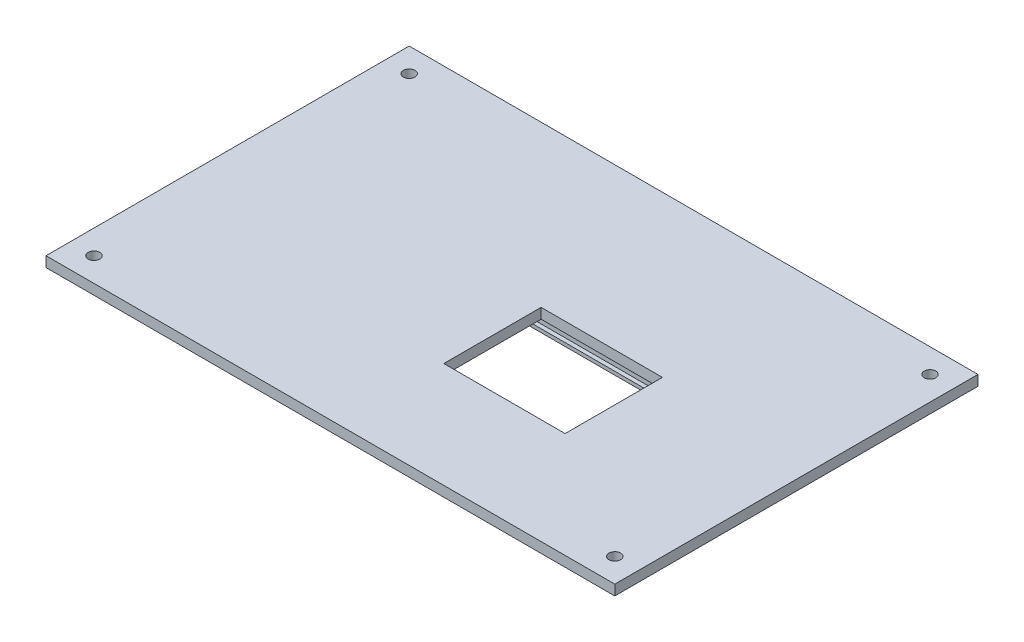
ISO-10303-21;
HEADER;
FILE_DESCRIPTION(('STEP AP214'),'2;1');
FILE_NAME('part.step','',(''),(''),'','','');
FILE_SCHEMA(('AUTOMOTIVE_DESIGN { 1 0 10303 214 1 1 1 1 }'));
ENDSEC;
DATA;
#1=APPLICATION_CONTEXT('core data for automotive mechanical design processes');
#2=APPLICATION_PROTOCOL_DEFINITION('international standard','automotive_design',2000,#1);
#3=PRODUCT_CONTEXT('',#1,'mechanical');
#4=PRODUCT('Part','Part','',(#3));
#5=PRODUCT_RELATED_PRODUCT_CATEGORY('part','',(#4));
#6=PRODUCT_DEFINITION_FORMATION('','',#4);
#7=PRODUCT_DEFINITION_CONTEXT('part definition',#1,'design');
#8=PRODUCT_DEFINITION('design','',#6,#7);
#9=PRODUCT_DEFINITION_SHAPE('','',#8);
#10=(LENGTH_UNIT() NAMED_UNIT(*) SI_UNIT(.MILLI.,.METRE.));
#11=(NAMED_UNIT(*) PLANE_ANGLE_UNIT() SI_UNIT($,.RADIAN.));
#12=(NAMED_UNIT(*) SI_UNIT($,.STERADIAN.) SOLID_ANGLE_UNIT());
#13=UNCERTAINTY_MEASURE_WITH_UNIT(LENGTH_MEASURE(1.E-05),#10,'distance_accuracy_value','');
#14=(GEOMETRIC_REPRESENTATION_CONTEXT(3) GLOBAL_UNCERTAINTY_ASSIGNED_CONTEXT((#13)) GLOBAL_UNIT_ASSIGNED_CONTEXT((#10,
#11,#12)) REPRESENTATION_CONTEXT('',''));
#15=CARTESIAN_POINT('',(0.,0.,0.));
#16=DIRECTION('',(0.,0.,1.));
#17=DIRECTION('',(1.,0.,0.));
#18=AXIS2_PLACEMENT_3D('',#15,#16,#17);
#19=CARTESIAN_POINT('',(0.,91.,0.));
#20=DIRECTION('',(0.,1.,0.));
#21=DIRECTION('',(0.,0.,1.));
#22=AXIS2_PLACEMENT_3D('',#19,#20,#21);
#23=PLANE('',#22);
#24=CARTESIAN_POINT('',(-76.,91.,46.));
#25=DIRECTION('',(0.,1.,0.));
#26=DIRECTION('',(0.,0.,1.));
#27=AXIS2_PLACEMENT_3D('',#24,#25,#26);
#28=CIRCLE('',#27,1.69999999999999);
#29=CARTESIAN_POINT('',(-76.,91.,47.7));
#30=VERTEX_POINT('',#29);
#31=EDGE_CURVE('E290',#30,#30,#28,.T.);
#32=ORIENTED_EDGE('',*,*,#31,.F.);
#33=EDGE_LOOP('',(#32));
#34=FACE_BOUND('',#33,.T.);
#35=CARTESIAN_POINT('',(76.,91.,-46.));
#36=DIRECTION('',(0.,1.,0.));
#37=DIRECTION('',(0.,0.,1.));
#38=AXIS2_PLACEMENT_3D('',#35,#36,#37);
#39=CIRCLE('',#38,1.69999999999999);
#40=CARTESIAN_POINT('',(76.,91.,-44.3));
#41=VERTEX_POINT('',#40);
#42=EDGE_CURVE('E286',#41,#41,#39,.T.);
#43=ORIENTED_EDGE('',*,*,#42,.F.);
#44=EDGE_LOOP('',(#43));
#45=FACE_BOUND('',#44,.T.);
#46=CARTESIAN_POINT('',(76.,91.,46.));
#47=DIRECTION('',(0.,1.,0.));
#48=DIRECTION('',(0.,0.,1.));
#49=AXIS2_PLACEMENT_3D('',#46,#47,#48);
#50=CIRCLE('',#49,1.69999999999999);
#51=CARTESIAN_POINT('',(76.,91.,47.7));
#52=VERTEX_POINT('',#51);
#53=EDGE_CURVE('E254',#52,#52,#50,.T.);
#54=ORIENTED_EDGE('',*,*,#53,.F.);
#55=EDGE_LOOP('',(#54));
#56=FACE_BOUND('',#55,.T.);
#57=CARTESIAN_POINT('',(-76.,91.,-46.));
#58=DIRECTION('',(0.,1.,0.));
#59=DIRECTION('',(0.,0.,1.));
#60=AXIS2_PLACEMENT_3D('',#57,#58,#59);
#61=CIRCLE('',#60,1.69999999999999);
#62=CARTESIAN_POINT('',(-76.,91.,-44.3));
#63=VERTEX_POINT('',#62);
#64=EDGE_CURVE('E293',#63,#63,#61,.T.);
#65=ORIENTED_EDGE('',*,*,#64,.F.);
#66=EDGE_LOOP('',(#65));
#67=FACE_BOUND('',#66,.T.);
#68=DIRECTION('',(0.,0.,1.));
#69=VECTOR('',#68,1.);
#70=CARTESIAN_POINT('',(-83.,91.,-53.));
#71=LINE('',#70,#69);
#72=CARTESIAN_POINT('',(-83.,91.,-53.));
#73=VERTEX_POINT('',#72);
#74=CARTESIAN_POINT('',(-83.,91.,53.));
#75=VERTEX_POINT('',#74);
#76=EDGE_CURVE('E319',#73,#75,#71,.T.);
#77=ORIENTED_EDGE('',*,*,#76,.T.);
#78=DIRECTION('',(1.,0.,0.));
#79=VECTOR('',#78,1.);
#80=CARTESIAN_POINT('',(-83.,91.,53.));
#81=LINE('',#80,#79);
#82=CARTESIAN_POINT('',(83.,91.,53.));
#83=VERTEX_POINT('',#82);
#84=EDGE_CURVE('E322',#75,#83,#81,.T.);
#85=ORIENTED_EDGE('',*,*,#84,.T.);
#86=DIRECTION('',(0.,0.,-1.));
#87=VECTOR('',#86,1.);
#88=CARTESIAN_POINT('',(83.,91.,53.));
#89=LINE('',#88,#87);
#90=CARTESIAN_POINT('',(83.,91.,-53.));
#91=VERTEX_POINT('',#90);
#92=EDGE_CURVE('E321',#83,#91,#89,.T.);
#93=ORIENTED_EDGE('',*,*,#92,.T.);
#94=DIRECTION('',(-1.,0.,0.));
#95=VECTOR('',#94,1.);
#96=CARTESIAN_POINT('',(83.,91.,-53.));
#97=LINE('',#96,#95);
#98=EDGE_CURVE('E329',#91,#73,#97,.T.);
#99=ORIENTED_EDGE('',*,*,#98,.T.);
#100=EDGE_LOOP('',(#77,#85,#93,#99));
#101=FACE_BOUND('',#100,.T.);
#102=DIRECTION('',(-1.,0.,0.));
#103=VECTOR('',#102,1.);
#104=CARTESIAN_POINT('',(2.3,91.,-6.2));
#105=LINE('',#104,#103);
#106=CARTESIAN_POINT('',(37.7,91.,-6.2));
#107=VERTEX_POINT('',#106);
#108=CARTESIAN_POINT('',(2.3,91.,-6.2));
#109=VERTEX_POINT('',#108);
#110=EDGE_CURVE('E299',#107,#109,#105,.T.);
#111=ORIENTED_EDGE('',*,*,#110,.F.);
#112=DIRECTION('',(0.,0.,-1.));
#113=VECTOR('',#112,1.);
#114=CARTESIAN_POINT('',(37.7,91.,22.2));
#115=LINE('',#114,#113);
#116=CARTESIAN_POINT('',(37.7,91.,22.2));
#117=VERTEX_POINT('',#116);
#118=EDGE_CURVE('E300',#117,#107,#115,.T.);
#119=ORIENTED_EDGE('',*,*,#118,.F.);
#120=DIRECTION('',(1.,0.,0.));
#121=VECTOR('',#120,1.);
#122=CARTESIAN_POINT('',(2.3,91.,22.2));
#123=LINE('',#122,#121);
#124=CARTESIAN_POINT('',(2.3,91.,22.2));
#125=VERTEX_POINT('',#124);
#126=EDGE_CURVE('E302',#125,#117,#123,.T.);
#127=ORIENTED_EDGE('',*,*,#126,.F.);
#128=DIRECTION('',(0.,0.,1.));
#129=VECTOR('',#128,1.);
#130=CARTESIAN_POINT('',(2.3,91.,22.2));
#131=LINE('',#130,#129);
#132=EDGE_CURVE('E301',#109,#125,#131,.T.);
#133=ORIENTED_EDGE('',*,*,#132,.F.);
#134=EDGE_LOOP('',(#111,#119,#127,#133));
#135=FACE_BOUND('',#134,.T.);
#136=ADVANCED_FACE('F43',(#34,#45,#56,#67,#101,#135),#23,.T.);
#137=CARTESIAN_POINT('',(0.,88.,0.));
#138=DIRECTION('',(0.,1.,0.));
#139=DIRECTION('',(0.,0.,1.));
#140=AXIS2_PLACEMENT_3D('',#137,#138,#139);
#141=PLANE('',#140);
#142=DIRECTION('',(-1.,0.,0.));
#143=VECTOR('',#142,1.);
#144=CARTESIAN_POINT('',(44.,88.,-11.8));
#145=LINE('',#144,#143);
#146=CARTESIAN_POINT('',(44.,88.,-11.8));
#147=VERTEX_POINT('',#146);
#148=CARTESIAN_POINT('',(-4.,88.,-11.8));
#149=VERTEX_POINT('',#148);
#150=EDGE_CURVE('E191',#147,#149,#145,.T.);
#151=ORIENTED_EDGE('',*,*,#150,.T.);
#152=DIRECTION('',(0.,0.,1.));
#153=VECTOR('',#152,1.);
#154=CARTESIAN_POINT('',(-4.,88.,-11.8));
#155=LINE('',#154,#153);
#156=CARTESIAN_POINT('',(-4.,88.,-9.8));
#157=VERTEX_POINT('',#156);
#158=EDGE_CURVE('E239',#149,#157,#155,.T.);
#159=ORIENTED_EDGE('',*,*,#158,.T.);
#160=DIRECTION('',(1.,0.,0.));
#161=VECTOR('',#160,1.);
#162=CARTESIAN_POINT('',(-4.,88.,-9.8));
#163=LINE('',#162,#161);
#164=CARTESIAN_POINT('',(44.,88.,-9.8));
#165=VERTEX_POINT('',#164);
#166=EDGE_CURVE('E243',#157,#165,#163,.T.);
#167=ORIENTED_EDGE('',*,*,#166,.T.);
#168=DIRECTION('',(0.,0.,-1.));
#169=VECTOR('',#168,1.);
#170=CARTESIAN_POINT('',(44.,88.,-9.8));
#171=LINE('',#170,#169);
#172=EDGE_CURVE('E250',#165,#147,#171,.T.);
#173=ORIENTED_EDGE('',*,*,#172,.T.);
#174=EDGE_LOOP('',(#151,#159,#167,#173));
#175=FACE_BOUND('',#174,.T.);
#176=DIRECTION('',(-1.,0.,0.));
#177=VECTOR('',#176,1.);
#178=CARTESIAN_POINT('',(44.,88.,25.8));
#179=LINE('',#178,#177);
#180=CARTESIAN_POINT('',(44.,88.,25.8));
#181=VERTEX_POINT('',#180);
#182=CARTESIAN_POINT('',(-4.,88.,25.8));
#183=VERTEX_POINT('',#182);
#184=EDGE_CURVE('E266',#181,#183,#179,.T.);
#185=ORIENTED_EDGE('',*,*,#184,.T.);
#186=DIRECTION('',(0.,0.,1.));
#187=VECTOR('',#186,1.);
#188=CARTESIAN_POINT('',(-4.,88.,25.8));
#189=LINE('',#188,#187);
#190=CARTESIAN_POINT('',(-4.,88.,27.8));
#191=VERTEX_POINT('',#190);
#192=EDGE_CURVE('E242',#183,#191,#189,.T.);
#193=ORIENTED_EDGE('',*,*,#192,.T.);
#194=DIRECTION('',(1.,0.,0.));
#195=VECTOR('',#194,1.);
#196=CARTESIAN_POINT('',(-4.,88.,27.8));
#197=LINE('',#196,#195);
#198=CARTESIAN_POINT('',(44.,88.,27.8));
#199=VERTEX_POINT('',#198);
#200=EDGE_CURVE('E274',#191,#199,#197,.T.);
#201=ORIENTED_EDGE('',*,*,#200,.T.);
#202=DIRECTION('',(0.,0.,-1.));
#203=VECTOR('',#202,1.);
#204=CARTESIAN_POINT('',(44.,88.,27.8));
#205=LINE('',#204,#203);
#206=EDGE_CURVE('E267',#199,#181,#205,.T.);
#207=ORIENTED_EDGE('',*,*,#206,.T.);
#208=EDGE_LOOP('',(#185,#193,#201,#207));
#209=FACE_BOUND('',#208,.T.);
#210=CARTESIAN_POINT('',(-76.,88.,46.));
#211=DIRECTION('',(0.,1.,0.));
#212=DIRECTION('',(0.,0.,1.));
#213=AXIS2_PLACEMENT_3D('',#210,#211,#212);
#214=CIRCLE('',#213,1.69999999999999);
#215=CARTESIAN_POINT('',(-76.,88.,47.7));
#216=VERTEX_POINT('',#215);
#217=EDGE_CURVE('E50',#216,#216,#214,.F.);
#218=ORIENTED_EDGE('',*,*,#217,.F.);
#219=EDGE_LOOP('',(#218));
#220=FACE_BOUND('',#219,.T.);
#221=CARTESIAN_POINT('',(76.,88.,-46.));
#222=DIRECTION('',(0.,1.,0.));
#223=DIRECTION('',(0.,0.,1.));
#224=AXIS2_PLACEMENT_3D('',#221,#222,#223);
#225=CIRCLE('',#224,1.69999999999999);
#226=CARTESIAN_POINT('',(76.,88.,-44.3));
#227=VERTEX_POINT('',#226);
#228=EDGE_CURVE('E358',#227,#227,#225,.F.);
#229=ORIENTED_EDGE('',*,*,#228,.F.);
#230=EDGE_LOOP('',(#229));
#231=FACE_BOUND('',#230,.T.);
#232=CARTESIAN_POINT('',(76.,88.,46.));
#233=DIRECTION('',(0.,1.,0.));
#234=DIRECTION('',(0.,0.,1.));
#235=AXIS2_PLACEMENT_3D('',#232,#233,#234);
#236=CIRCLE('',#235,1.69999999999999);
#237=CARTESIAN_POINT('',(76.,88.,47.7));
#238=VERTEX_POINT('',#237);
#239=EDGE_CURVE('E353',#238,#238,#236,.F.);
#240=ORIENTED_EDGE('',*,*,#239,.F.);
#241=EDGE_LOOP('',(#240));
#242=FACE_BOUND('',#241,.T.);
#243=CARTESIAN_POINT('',(-76.,88.,-46.));
#244=DIRECTION('',(0.,1.,0.));
#245=DIRECTION('',(0.,0.,1.));
#246=AXIS2_PLACEMENT_3D('',#243,#244,#245);
#247=CIRCLE('',#246,1.69999999999999);
#248=CARTESIAN_POINT('',(-76.,88.,-44.3));
#249=VERTEX_POINT('',#248);
#250=EDGE_CURVE('E298',#249,#249,#247,.F.);
#251=ORIENTED_EDGE('',*,*,#250,.F.);
#252=EDGE_LOOP('',(#251));
#253=FACE_BOUND('',#252,.T.);
#254=DIRECTION('',(0.,0.,1.));
#255=VECTOR('',#254,1.);
#256=CARTESIAN_POINT('',(-83.,88.,-53.));
#257=LINE('',#256,#255);
#258=CARTESIAN_POINT('',(-83.,88.,-53.));
#259=VERTEX_POINT('',#258);
#260=CARTESIAN_POINT('',(-83.,88.,53.));
#261=VERTEX_POINT('',#260);
#262=EDGE_CURVE('E320',#259,#261,#257,.T.);
#263=ORIENTED_EDGE('',*,*,#262,.F.);
#264=DIRECTION('',(-1.,0.,0.));
#265=VECTOR('',#264,1.);
#266=CARTESIAN_POINT('',(83.,88.,-53.));
#267=LINE('',#266,#265);
#268=CARTESIAN_POINT('',(83.,88.,-53.));
#269=VERTEX_POINT('',#268);
#270=EDGE_CURVE('E325',#269,#259,#267,.T.);
#271=ORIENTED_EDGE('',*,*,#270,.F.);
#272=DIRECTION('',(0.,0.,-1.));
#273=VECTOR('',#272,1.);
#274=CARTESIAN_POINT('',(83.,88.,53.));
#275=LINE('',#274,#273);
#276=CARTESIAN_POINT('',(83.,88.,53.));
#277=VERTEX_POINT('',#276);
#278=EDGE_CURVE('E335',#277,#269,#275,.T.);
#279=ORIENTED_EDGE('',*,*,#278,.F.);
#280=DIRECTION('',(1.,0.,0.));
#281=VECTOR('',#280,1.);
#282=CARTESIAN_POINT('',(-83.,88.,53.));
#283=LINE('',#282,#281);
#284=EDGE_CURVE('E334',#261,#277,#283,.T.);
#285=ORIENTED_EDGE('',*,*,#284,.F.);
#286=EDGE_LOOP('',(#263,#271,#279,#285));
#287=FACE_BOUND('',#286,.T.);
#288=DIRECTION('',(0.,0.,1.));
#289=VECTOR('',#288,1.);
#290=CARTESIAN_POINT('',(37.7,88.,0.));
#291=LINE('',#290,#289);
#292=CARTESIAN_POINT('',(37.7,88.,-6.2));
#293=VERTEX_POINT('',#292);
#294=CARTESIAN_POINT('',(37.7,88.,22.2));
#295=VERTEX_POINT('',#294);
#296=EDGE_CURVE('E11',#293,#295,#291,.T.);
#297=ORIENTED_EDGE('',*,*,#296,.F.);
#298=DIRECTION('',(1.,0.,0.));
#299=VECTOR('',#298,1.);
#300=CARTESIAN_POINT('',(0.,88.,-6.2));
#301=LINE('',#300,#299);
#302=CARTESIAN_POINT('',(2.3,88.,-6.2));
#303=VERTEX_POINT('',#302);
#304=EDGE_CURVE('E55',#303,#293,#301,.T.);
#305=ORIENTED_EDGE('',*,*,#304,.F.);
#306=DIRECTION('',(0.,0.,-1.));
#307=VECTOR('',#306,1.);
#308=CARTESIAN_POINT('',(2.3,88.,0.));
#309=LINE('',#308,#307);
#310=CARTESIAN_POINT('',(2.3,88.,22.2));
#311=VERTEX_POINT('',#310);
#312=EDGE_CURVE('E348',#311,#303,#309,.T.);
#313=ORIENTED_EDGE('',*,*,#312,.F.);
#314=DIRECTION('',(-1.,0.,0.));
#315=VECTOR('',#314,1.);
#316=CARTESIAN_POINT('',(0.,88.,22.2));
#317=LINE('',#316,#315);
#318=EDGE_CURVE('E346',#295,#311,#317,.T.);
#319=ORIENTED_EDGE('',*,*,#318,.F.);
#320=EDGE_LOOP('',(#297,#305,#313,#319));
#321=FACE_BOUND('',#320,.T.);
#322=ADVANCED_FACE('F362',(#175,#209,#220,#231,#242,#253,#287,#321),#141,.F.);
#323=CARTESIAN_POINT('',(-83.,91.,-53.));
#324=DIRECTION('',(1.,0.,0.));
#325=DIRECTION('',(0.,0.,-1.));
#326=AXIS2_PLACEMENT_3D('',#323,#324,#325);
#327=PLANE('',#326);
#328=ORIENTED_EDGE('',*,*,#262,.T.);
#329=DIRECTION('',(0.,-1.,0.));
#330=VECTOR('',#329,1.);
#331=CARTESIAN_POINT('',(-83.,91.,53.));
#332=LINE('',#331,#330);
#333=EDGE_CURVE('E341',#75,#261,#332,.T.);
#334=ORIENTED_EDGE('',*,*,#333,.F.);
#335=ORIENTED_EDGE('',*,*,#76,.F.);
#336=DIRECTION('',(0.,-1.,0.));
#337=VECTOR('',#336,1.);
#338=CARTESIAN_POINT('',(-83.,91.,-53.));
#339=LINE('',#338,#337);
#340=EDGE_CURVE('E330',#73,#259,#339,.T.);
#341=ORIENTED_EDGE('',*,*,#340,.T.);
#342=EDGE_LOOP('',(#328,#334,#335,#341));
#343=FACE_BOUND('',#342,.T.);
#344=ADVANCED_FACE('F44',(#343),#327,.F.);
#345=CARTESIAN_POINT('',(-83.,91.,53.));
#346=DIRECTION('',(0.,0.,-1.));
#347=DIRECTION('',(-1.,0.,0.));
#348=AXIS2_PLACEMENT_3D('',#345,#346,#347);
#349=PLANE('',#348);
#350=ORIENTED_EDGE('',*,*,#284,.T.);
#351=DIRECTION('',(0.,-1.,0.));
#352=VECTOR('',#351,1.);
#353=CARTESIAN_POINT('',(83.,91.,53.));
#354=LINE('',#353,#352);
#355=EDGE_CURVE('E342',#83,#277,#354,.T.);
#356=ORIENTED_EDGE('',*,*,#355,.F.);
#357=ORIENTED_EDGE('',*,*,#84,.F.);
#358=ORIENTED_EDGE('',*,*,#333,.T.);
#359=EDGE_LOOP('',(#350,#356,#357,#358));
#360=FACE_BOUND('',#359,.T.);
#361=ADVANCED_FACE('F424',(#360),#349,.F.);
#362=CARTESIAN_POINT('',(83.,91.,53.));
#363=DIRECTION('',(-1.,0.,0.));
#364=DIRECTION('',(0.,0.,1.));
#365=AXIS2_PLACEMENT_3D('',#362,#363,#364);
#366=PLANE('',#365);
#367=ORIENTED_EDGE('',*,*,#278,.T.);
#368=DIRECTION('',(0.,-1.,0.));
#369=VECTOR('',#368,1.);
#370=CARTESIAN_POINT('',(83.,91.,-53.));
#371=LINE('',#370,#369);
#372=EDGE_CURVE('E336',#91,#269,#371,.T.);
#373=ORIENTED_EDGE('',*,*,#372,.F.);
#374=ORIENTED_EDGE('',*,*,#92,.F.);
#375=ORIENTED_EDGE('',*,*,#355,.T.);
#376=EDGE_LOOP('',(#367,#373,#374,#375));
#377=FACE_BOUND('',#376,.T.);
#378=ADVANCED_FACE('F422',(#377),#366,.F.);
#379=CARTESIAN_POINT('',(83.,91.,-53.));
#380=DIRECTION('',(0.,0.,1.));
#381=DIRECTION('',(1.,0.,0.));
#382=AXIS2_PLACEMENT_3D('',#379,#380,#381);
#383=PLANE('',#382);
#384=ORIENTED_EDGE('',*,*,#270,.T.);
#385=ORIENTED_EDGE('',*,*,#340,.F.);
#386=ORIENTED_EDGE('',*,*,#98,.F.);
#387=ORIENTED_EDGE('',*,*,#372,.T.);
#388=EDGE_LOOP('',(#384,#385,#386,#387));
#389=FACE_BOUND('',#388,.T.);
#390=ADVANCED_FACE('F418',(#389),#383,.F.);
#391=CARTESIAN_POINT('',(37.7,91.,22.2));
#392=DIRECTION('',(-1.,0.,0.));
#393=DIRECTION('',(0.,0.,1.));
#394=AXIS2_PLACEMENT_3D('',#391,#392,#393);
#395=PLANE('',#394);
#396=ORIENTED_EDGE('',*,*,#296,.T.);
#397=DIRECTION('',(0.,-1.,0.));
#398=VECTOR('',#397,1.);
#399=CARTESIAN_POINT('',(37.7,91.,22.2));
#400=LINE('',#399,#398);
#401=EDGE_CURVE('E306',#117,#295,#400,.T.);
#402=ORIENTED_EDGE('',*,*,#401,.F.);
#403=ORIENTED_EDGE('',*,*,#118,.T.);
#404=DIRECTION('',(0.,-1.,0.));
#405=VECTOR('',#404,1.);
#406=CARTESIAN_POINT('',(37.7,91.,-6.2));
#407=LINE('',#406,#405);
#408=EDGE_CURVE('E313',#107,#293,#407,.T.);
#409=ORIENTED_EDGE('',*,*,#408,.T.);
#410=EDGE_LOOP('',(#396,#402,#403,#409));
#411=FACE_BOUND('',#410,.T.);
#412=ADVANCED_FACE('F381',(#411),#395,.T.);
#413=CARTESIAN_POINT('',(2.3,91.,-6.2));
#414=DIRECTION('',(0.,0.,1.));
#415=DIRECTION('',(1.,0.,0.));
#416=AXIS2_PLACEMENT_3D('',#413,#414,#415);
#417=PLANE('',#416);
#418=ORIENTED_EDGE('',*,*,#304,.T.);
#419=ORIENTED_EDGE('',*,*,#408,.F.);
#420=ORIENTED_EDGE('',*,*,#110,.T.);
#421=DIRECTION('',(0.,-1.,0.));
#422=VECTOR('',#421,1.);
#423=CARTESIAN_POINT('',(2.3,91.,-6.2));
#424=LINE('',#423,#422);
#425=EDGE_CURVE('E311',#109,#303,#424,.T.);
#426=ORIENTED_EDGE('',*,*,#425,.T.);
#427=EDGE_LOOP('',(#418,#419,#420,#426));
#428=FACE_BOUND('',#427,.T.);
#429=ADVANCED_FACE('F386',(#428),#417,.T.);
#430=CARTESIAN_POINT('',(2.3,91.,22.2));
#431=DIRECTION('',(1.,0.,0.));
#432=DIRECTION('',(0.,0.,-1.));
#433=AXIS2_PLACEMENT_3D('',#430,#431,#432);
#434=PLANE('',#433);
#435=ORIENTED_EDGE('',*,*,#312,.T.);
#436=ORIENTED_EDGE('',*,*,#425,.F.);
#437=ORIENTED_EDGE('',*,*,#132,.T.);
#438=DIRECTION('',(0.,-1.,0.));
#439=VECTOR('',#438,1.);
#440=CARTESIAN_POINT('',(2.3,91.,22.2));
#441=LINE('',#440,#439);
#442=EDGE_CURVE('E308',#125,#311,#441,.T.);
#443=ORIENTED_EDGE('',*,*,#442,.T.);
#444=EDGE_LOOP('',(#435,#436,#437,#443));
#445=FACE_BOUND('',#444,.T.);
#446=ADVANCED_FACE('F392',(#445),#434,.T.);
#447=CARTESIAN_POINT('',(2.3,91.,22.2));
#448=DIRECTION('',(0.,0.,-1.));
#449=DIRECTION('',(-1.,0.,0.));
#450=AXIS2_PLACEMENT_3D('',#447,#448,#449);
#451=PLANE('',#450);
#452=ORIENTED_EDGE('',*,*,#318,.T.);
#453=ORIENTED_EDGE('',*,*,#442,.F.);
#454=ORIENTED_EDGE('',*,*,#126,.T.);
#455=ORIENTED_EDGE('',*,*,#401,.T.);
#456=EDGE_LOOP('',(#452,#453,#454,#455));
#457=FACE_BOUND('',#456,.T.);
#458=ADVANCED_FACE('F396',(#457),#451,.T.);
#459=CARTESIAN_POINT('',(-76.,91.,-46.));
#460=DIRECTION('',(0.,-1.,0.));
#461=DIRECTION('',(0.,0.,-1.));
#462=AXIS2_PLACEMENT_3D('',#459,#460,#461);
#463=CYLINDRICAL_SURFACE('',#462,1.69999999999999);
#464=ORIENTED_EDGE('',*,*,#64,.T.);
#465=EDGE_LOOP('',(#464));
#466=FACE_BOUND('',#465,.T.);
#467=ORIENTED_EDGE('',*,*,#250,.T.);
#468=EDGE_LOOP('',(#467));
#469=FACE_BOUND('',#468,.T.);
#470=ADVANCED_FACE('F398',(#466,#469),#463,.F.);
#471=CARTESIAN_POINT('',(76.,91.,46.));
#472=DIRECTION('',(0.,-1.,0.));
#473=DIRECTION('',(0.,0.,-1.));
#474=AXIS2_PLACEMENT_3D('',#471,#472,#473);
#475=CYLINDRICAL_SURFACE('',#474,1.69999999999999);
#476=ORIENTED_EDGE('',*,*,#53,.T.);
#477=EDGE_LOOP('',(#476));
#478=FACE_BOUND('',#477,.T.);
#479=ORIENTED_EDGE('',*,*,#239,.T.);
#480=EDGE_LOOP('',(#479));
#481=FACE_BOUND('',#480,.T.);
#482=ADVANCED_FACE('F407',(#478,#481),#475,.F.);
#483=CARTESIAN_POINT('',(76.,91.,-46.));
#484=DIRECTION('',(0.,-1.,0.));
#485=DIRECTION('',(0.,0.,-1.));
#486=AXIS2_PLACEMENT_3D('',#483,#484,#485);
#487=CYLINDRICAL_SURFACE('',#486,1.69999999999999);
#488=ORIENTED_EDGE('',*,*,#42,.T.);
#489=EDGE_LOOP('',(#488));
#490=FACE_BOUND('',#489,.T.);
#491=ORIENTED_EDGE('',*,*,#228,.T.);
#492=EDGE_LOOP('',(#491));
#493=FACE_BOUND('',#492,.T.);
#494=ADVANCED_FACE('F508',(#490,#493),#487,.F.);
#495=CARTESIAN_POINT('',(-76.,91.,46.));
#496=DIRECTION('',(0.,-1.,0.));
#497=DIRECTION('',(0.,0.,-1.));
#498=AXIS2_PLACEMENT_3D('',#495,#496,#497);
#499=CYLINDRICAL_SURFACE('',#498,1.69999999999999);
#500=ORIENTED_EDGE('',*,*,#31,.T.);
#501=EDGE_LOOP('',(#500));
#502=FACE_BOUND('',#501,.T.);
#503=ORIENTED_EDGE('',*,*,#217,.T.);
#504=EDGE_LOOP('',(#503));
#505=FACE_BOUND('',#504,.T.);
#506=ADVANCED_FACE('F361',(#502,#505),#499,.F.);
#507=CARTESIAN_POINT('',(-4.,82.2,25.8));
#508=DIRECTION('',(-1.,0.,0.));
#509=DIRECTION('',(0.,0.,1.));
#510=AXIS2_PLACEMENT_3D('',#507,#508,#509);
#511=PLANE('',#510);
#512=ORIENTED_EDGE('',*,*,#192,.F.);
#513=DIRECTION('',(0.,1.,0.));
#514=VECTOR('',#513,1.);
#515=CARTESIAN_POINT('',(-4.,82.2,25.8));
#516=LINE('',#515,#514);
#517=CARTESIAN_POINT('',(-4.,83.2,25.8));
#518=VERTEX_POINT('',#517);
#519=EDGE_CURVE('E220',#518,#183,#516,.T.);
#520=ORIENTED_EDGE('',*,*,#519,.F.);
#521=DIRECTION('',(0.,0.,1.));
#522=VECTOR('',#521,1.);
#523=CARTESIAN_POINT('',(-4.,83.2,24.6));
#524=LINE('',#523,#522);
#525=CARTESIAN_POINT('',(-4.,83.2,24.6));
#526=VERTEX_POINT('',#525);
#527=EDGE_CURVE('E211',#526,#518,#524,.T.);
#528=ORIENTED_EDGE('',*,*,#527,.F.);
#529=DIRECTION('',(0.,1.,0.));
#530=VECTOR('',#529,1.);
#531=CARTESIAN_POINT('',(-4.,82.2,24.6));
#532=LINE('',#531,#530);
#533=CARTESIAN_POINT('',(-4.,82.2,24.6));
#534=VERTEX_POINT('',#533);
#535=EDGE_CURVE('E225',#534,#526,#532,.T.);
#536=ORIENTED_EDGE('',*,*,#535,.F.);
#537=DIRECTION('',(0.,0.,1.));
#538=VECTOR('',#537,1.);
#539=CARTESIAN_POINT('',(-4.,82.2,25.8));
#540=LINE('',#539,#538);
#541=CARTESIAN_POINT('',(-4.,82.2,27.8));
#542=VERTEX_POINT('',#541);
#543=EDGE_CURVE('E272',#534,#542,#540,.T.);
#544=ORIENTED_EDGE('',*,*,#543,.T.);
#545=DIRECTION('',(0.,1.,0.));
#546=VECTOR('',#545,1.);
#547=CARTESIAN_POINT('',(-4.,82.2,27.8));
#548=LINE('',#547,#546);
#549=EDGE_CURVE('E256',#542,#191,#548,.T.);
#550=ORIENTED_EDGE('',*,*,#549,.T.);
#551=EDGE_LOOP('',(#512,#520,#528,#536,#544,#550));
#552=FACE_BOUND('',#551,.T.);
#553=ADVANCED_FACE('F530',(#552),#511,.T.);
#554=CARTESIAN_POINT('',(44.,82.2,25.8));
#555=DIRECTION('',(0.,0.,-1.));
#556=DIRECTION('',(-1.,0.,0.));
#557=AXIS2_PLACEMENT_3D('',#554,#555,#556);
#558=PLANE('',#557);
#559=DIRECTION('',(1.,0.,0.));
#560=VECTOR('',#559,1.);
#561=CARTESIAN_POINT('',(-4.,83.2,25.8));
#562=LINE('',#561,#560);
#563=CARTESIAN_POINT('',(44.,83.2,25.8));
#564=VERTEX_POINT('',#563);
#565=EDGE_CURVE('E58',#518,#564,#562,.T.);
#566=ORIENTED_EDGE('',*,*,#565,.F.);
#567=ORIENTED_EDGE('',*,*,#519,.T.);
#568=ORIENTED_EDGE('',*,*,#184,.F.);
#569=DIRECTION('',(0.,1.,0.));
#570=VECTOR('',#569,1.);
#571=CARTESIAN_POINT('',(44.,82.2,25.8));
#572=LINE('',#571,#570);
#573=EDGE_CURVE('E263',#564,#181,#572,.T.);
#574=ORIENTED_EDGE('',*,*,#573,.F.);
#575=EDGE_LOOP('',(#566,#567,#568,#574));
#576=FACE_BOUND('',#575,.T.);
#577=ADVANCED_FACE('F536',(#576),#558,.T.);
#578=CARTESIAN_POINT('',(44.,82.2,27.8));
#579=DIRECTION('',(1.,0.,0.));
#580=DIRECTION('',(0.,0.,-1.));
#581=AXIS2_PLACEMENT_3D('',#578,#579,#580);
#582=PLANE('',#581);
#583=ORIENTED_EDGE('',*,*,#206,.F.);
#584=DIRECTION('',(0.,1.,0.));
#585=VECTOR('',#584,1.);
#586=CARTESIAN_POINT('',(44.,82.2,27.8));
#587=LINE('',#586,#585);
#588=CARTESIAN_POINT('',(44.,82.2,27.8));
#589=VERTEX_POINT('',#588);
#590=EDGE_CURVE('E261',#589,#199,#587,.T.);
#591=ORIENTED_EDGE('',*,*,#590,.F.);
#592=DIRECTION('',(0.,0.,-1.));
#593=VECTOR('',#592,1.);
#594=CARTESIAN_POINT('',(44.,82.2,27.8));
#595=LINE('',#594,#593);
#596=CARTESIAN_POINT('',(44.,82.2,24.6));
#597=VERTEX_POINT('',#596);
#598=EDGE_CURVE('E264',#589,#597,#595,.T.);
#599=ORIENTED_EDGE('',*,*,#598,.T.);
#600=DIRECTION('',(0.,1.,0.));
#601=VECTOR('',#600,1.);
#602=CARTESIAN_POINT('',(44.,82.2,24.6));
#603=LINE('',#602,#601);
#604=CARTESIAN_POINT('',(44.,83.2,24.6));
#605=VERTEX_POINT('',#604);
#606=EDGE_CURVE('E217',#597,#605,#603,.T.);
#607=ORIENTED_EDGE('',*,*,#606,.T.);
#608=DIRECTION('',(0.,0.,-1.));
#609=VECTOR('',#608,1.);
#610=CARTESIAN_POINT('',(44.,83.2,25.8));
#611=LINE('',#610,#609);
#612=EDGE_CURVE('E226',#564,#605,#611,.T.);
#613=ORIENTED_EDGE('',*,*,#612,.F.);
#614=ORIENTED_EDGE('',*,*,#573,.T.);
#615=EDGE_LOOP('',(#583,#591,#599,#607,#613,#614));
#616=FACE_BOUND('',#615,.T.);
#617=ADVANCED_FACE('F552',(#616),#582,.T.);
#618=CARTESIAN_POINT('',(-4.,82.2,27.8));
#619=DIRECTION('',(0.,0.,1.));
#620=DIRECTION('',(1.,0.,0.));
#621=AXIS2_PLACEMENT_3D('',#618,#619,#620);
#622=PLANE('',#621);
#623=ORIENTED_EDGE('',*,*,#200,.F.);
#624=ORIENTED_EDGE('',*,*,#549,.F.);
#625=DIRECTION('',(1.,0.,0.));
#626=VECTOR('',#625,1.);
#627=CARTESIAN_POINT('',(-4.,82.2,27.8));
#628=LINE('',#627,#626);
#629=EDGE_CURVE('E278',#542,#589,#628,.T.);
#630=ORIENTED_EDGE('',*,*,#629,.T.);
#631=ORIENTED_EDGE('',*,*,#590,.T.);
#632=EDGE_LOOP('',(#623,#624,#630,#631));
#633=FACE_BOUND('',#632,.T.);
#634=ADVANCED_FACE('F561',(#633),#622,.T.);
#635=CARTESIAN_POINT('',(0.,82.2,0.));
#636=DIRECTION('',(0.,1.,0.));
#637=DIRECTION('',(0.,0.,1.));
#638=AXIS2_PLACEMENT_3D('',#635,#636,#637);
#639=PLANE('',#638);
#640=ORIENTED_EDGE('',*,*,#543,.F.);
#641=DIRECTION('',(-1.,0.,0.));
#642=VECTOR('',#641,1.);
#643=CARTESIAN_POINT('',(44.,82.2,24.6));
#644=LINE('',#643,#642);
#645=EDGE_CURVE('E221',#597,#534,#644,.T.);
#646=ORIENTED_EDGE('',*,*,#645,.F.);
#647=ORIENTED_EDGE('',*,*,#598,.F.);
#648=ORIENTED_EDGE('',*,*,#629,.F.);
#649=EDGE_LOOP('',(#640,#646,#647,#648));
#650=FACE_BOUND('',#649,.T.);
#651=ADVANCED_FACE('F572',(#650),#639,.F.);
#652=CARTESIAN_POINT('',(-4.,82.2,-11.8));
#653=DIRECTION('',(-1.,0.,0.));
#654=DIRECTION('',(0.,0.,1.));
#655=AXIS2_PLACEMENT_3D('',#652,#653,#654);
#656=PLANE('',#655);
#657=ORIENTED_EDGE('',*,*,#158,.F.);
#658=DIRECTION('',(0.,1.,0.));
#659=VECTOR('',#658,1.);
#660=CARTESIAN_POINT('',(-4.,82.2,-11.8));
#661=LINE('',#660,#659);
#662=CARTESIAN_POINT('',(-4.,82.2,-11.8));
#663=VERTEX_POINT('',#662);
#664=EDGE_CURVE('E189',#663,#149,#661,.T.);
#665=ORIENTED_EDGE('',*,*,#664,.F.);
#666=DIRECTION('',(0.,0.,1.));
#667=VECTOR('',#666,1.);
#668=CARTESIAN_POINT('',(-4.,82.2,-11.8));
#669=LINE('',#668,#667);
#670=CARTESIAN_POINT('',(-4.,82.2,-8.6));
#671=VERTEX_POINT('',#670);
#672=EDGE_CURVE('E181',#663,#671,#669,.T.);
#673=ORIENTED_EDGE('',*,*,#672,.T.);
#674=DIRECTION('',(0.,1.,0.));
#675=VECTOR('',#674,1.);
#676=CARTESIAN_POINT('',(-4.,82.2,-8.6));
#677=LINE('',#676,#675);
#678=CARTESIAN_POINT('',(-4.,83.2,-8.6));
#679=VERTEX_POINT('',#678);
#680=EDGE_CURVE('E184',#671,#679,#677,.T.);
#681=ORIENTED_EDGE('',*,*,#680,.T.);
#682=DIRECTION('',(0.,0.,1.));
#683=VECTOR('',#682,1.);
#684=CARTESIAN_POINT('',(-4.,83.2,-9.8));
#685=LINE('',#684,#683);
#686=CARTESIAN_POINT('',(-4.,83.2,-9.8));
#687=VERTEX_POINT('',#686);
#688=EDGE_CURVE('E215',#687,#679,#685,.T.);
#689=ORIENTED_EDGE('',*,*,#688,.F.);
#690=DIRECTION('',(0.,1.,0.));
#691=VECTOR('',#690,1.);
#692=CARTESIAN_POINT('',(-4.,82.2,-9.8));
#693=LINE('',#692,#691);
#694=EDGE_CURVE('E237',#687,#157,#693,.T.);
#695=ORIENTED_EDGE('',*,*,#694,.T.);
#696=EDGE_LOOP('',(#657,#665,#673,#681,#689,#695));
#697=FACE_BOUND('',#696,.T.);
#698=ADVANCED_FACE('F182',(#697),#656,.T.);
#699=CARTESIAN_POINT('',(44.,82.2,-11.8));
#700=DIRECTION('',(0.,0.,-1.));
#701=DIRECTION('',(-1.,0.,0.));
#702=AXIS2_PLACEMENT_3D('',#699,#700,#701);
#703=PLANE('',#702);
#704=ORIENTED_EDGE('',*,*,#150,.F.);
#705=DIRECTION('',(0.,1.,0.));
#706=VECTOR('',#705,1.);
#707=CARTESIAN_POINT('',(44.,82.2,-11.8));
#708=LINE('',#707,#706);
#709=CARTESIAN_POINT('',(44.,82.2,-11.8));
#710=VERTEX_POINT('',#709);
#711=EDGE_CURVE('E251',#710,#147,#708,.T.);
#712=ORIENTED_EDGE('',*,*,#711,.F.);
#713=DIRECTION('',(-1.,0.,0.));
#714=VECTOR('',#713,1.);
#715=CARTESIAN_POINT('',(44.,82.2,-11.8));
#716=LINE('',#715,#714);
#717=EDGE_CURVE('E240',#710,#663,#716,.T.);
#718=ORIENTED_EDGE('',*,*,#717,.T.);
#719=ORIENTED_EDGE('',*,*,#664,.T.);
#720=EDGE_LOOP('',(#704,#712,#718,#719));
#721=FACE_BOUND('',#720,.T.);
#722=ADVANCED_FACE('F592',(#721),#703,.T.);
#723=CARTESIAN_POINT('',(44.,82.2,-9.8));
#724=DIRECTION('',(1.,0.,0.));
#725=DIRECTION('',(0.,0.,-1.));
#726=AXIS2_PLACEMENT_3D('',#723,#724,#725);
#727=PLANE('',#726);
#728=ORIENTED_EDGE('',*,*,#172,.F.);
#729=DIRECTION('',(0.,1.,0.));
#730=VECTOR('',#729,1.);
#731=CARTESIAN_POINT('',(44.,82.2,-9.8));
#732=LINE('',#731,#730);
#733=CARTESIAN_POINT('',(44.,83.2,-9.8));
#734=VERTEX_POINT('',#733);
#735=EDGE_CURVE('E257',#734,#165,#732,.T.);
#736=ORIENTED_EDGE('',*,*,#735,.F.);
#737=DIRECTION('',(0.,0.,-1.));
#738=VECTOR('',#737,1.);
#739=CARTESIAN_POINT('',(44.,83.2,-8.6));
#740=LINE('',#739,#738);
#741=CARTESIAN_POINT('',(44.,83.2,-8.6));
#742=VERTEX_POINT('',#741);
#743=EDGE_CURVE('E209',#742,#734,#740,.T.);
#744=ORIENTED_EDGE('',*,*,#743,.F.);
#745=DIRECTION('',(0.,1.,0.));
#746=VECTOR('',#745,1.);
#747=CARTESIAN_POINT('',(44.,82.2,-8.6));
#748=LINE('',#747,#746);
#749=CARTESIAN_POINT('',(44.,82.2,-8.6));
#750=VERTEX_POINT('',#749);
#751=EDGE_CURVE('E205',#750,#742,#748,.T.);
#752=ORIENTED_EDGE('',*,*,#751,.F.);
#753=DIRECTION('',(0.,0.,-1.));
#754=VECTOR('',#753,1.);
#755=CARTESIAN_POINT('',(44.,82.2,-9.8));
#756=LINE('',#755,#754);
#757=EDGE_CURVE('E194',#750,#710,#756,.T.);
#758=ORIENTED_EDGE('',*,*,#757,.T.);
#759=ORIENTED_EDGE('',*,*,#711,.T.);
#760=EDGE_LOOP('',(#728,#736,#744,#752,#758,#759));
#761=FACE_BOUND('',#760,.T.);
#762=ADVANCED_FACE('F603',(#761),#727,.T.);
#763=CARTESIAN_POINT('',(-4.,82.2,-9.8));
#764=DIRECTION('',(0.,0.,1.));
#765=DIRECTION('',(1.,0.,0.));
#766=AXIS2_PLACEMENT_3D('',#763,#764,#765);
#767=PLANE('',#766);
#768=DIRECTION('',(-1.,0.,0.));
#769=VECTOR('',#768,1.);
#770=CARTESIAN_POINT('',(44.,83.2,-9.8));
#771=LINE('',#770,#769);
#772=EDGE_CURVE('E70',#734,#687,#771,.T.);
#773=ORIENTED_EDGE('',*,*,#772,.F.);
#774=ORIENTED_EDGE('',*,*,#735,.T.);
#775=ORIENTED_EDGE('',*,*,#166,.F.);
#776=ORIENTED_EDGE('',*,*,#694,.F.);
#777=EDGE_LOOP('',(#773,#774,#775,#776));
#778=FACE_BOUND('',#777,.T.);
#779=ADVANCED_FACE('F612',(#778),#767,.T.);
#780=CARTESIAN_POINT('',(0.,82.2,0.));
#781=DIRECTION('',(0.,1.,0.));
#782=DIRECTION('',(0.,0.,1.));
#783=AXIS2_PLACEMENT_3D('',#780,#781,#782);
#784=PLANE('',#783);
#785=ORIENTED_EDGE('',*,*,#672,.F.);
#786=ORIENTED_EDGE('',*,*,#717,.F.);
#787=ORIENTED_EDGE('',*,*,#757,.F.);
#788=DIRECTION('',(1.,0.,0.));
#789=VECTOR('',#788,1.);
#790=CARTESIAN_POINT('',(-4.,82.2,-8.6));
#791=LINE('',#790,#789);
#792=EDGE_CURVE('E198',#671,#750,#791,.T.);
#793=ORIENTED_EDGE('',*,*,#792,.F.);
#794=EDGE_LOOP('',(#785,#786,#787,#793));
#795=FACE_BOUND('',#794,.T.);
#796=ADVANCED_FACE('F202',(#795),#784,.F.);
#797=CARTESIAN_POINT('',(-4.,82.2,-8.6));
#798=DIRECTION('',(0.,0.,1.));
#799=DIRECTION('',(1.,0.,0.));
#800=AXIS2_PLACEMENT_3D('',#797,#798,#799);
#801=PLANE('',#800);
#802=DIRECTION('',(1.,0.,0.));
#803=VECTOR('',#802,1.);
#804=CARTESIAN_POINT('',(-4.,83.2,-8.6));
#805=LINE('',#804,#803);
#806=EDGE_CURVE('E204',#679,#742,#805,.T.);
#807=ORIENTED_EDGE('',*,*,#806,.F.);
#808=ORIENTED_EDGE('',*,*,#680,.F.);
#809=ORIENTED_EDGE('',*,*,#792,.T.);
#810=ORIENTED_EDGE('',*,*,#751,.T.);
#811=EDGE_LOOP('',(#807,#808,#809,#810));
#812=FACE_BOUND('',#811,.T.);
#813=ADVANCED_FACE('F200',(#812),#801,.T.);
#814=CARTESIAN_POINT('',(0.,83.2,0.));
#815=DIRECTION('',(0.,1.,0.));
#816=DIRECTION('',(0.,0.,1.));
#817=AXIS2_PLACEMENT_3D('',#814,#815,#816);
#818=PLANE('',#817);
#819=ORIENTED_EDGE('',*,*,#688,.T.);
#820=ORIENTED_EDGE('',*,*,#806,.T.);
#821=ORIENTED_EDGE('',*,*,#743,.T.);
#822=ORIENTED_EDGE('',*,*,#772,.T.);
#823=EDGE_LOOP('',(#819,#820,#821,#822));
#824=FACE_BOUND('',#823,.T.);
#825=ADVANCED_FACE('F641',(#824),#818,.T.);
#826=CARTESIAN_POINT('',(44.,82.2,24.6));
#827=DIRECTION('',(0.,0.,-1.));
#828=DIRECTION('',(-1.,0.,0.));
#829=AXIS2_PLACEMENT_3D('',#826,#827,#828);
#830=PLANE('',#829);
#831=DIRECTION('',(-1.,0.,0.));
#832=VECTOR('',#831,1.);
#833=CARTESIAN_POINT('',(44.,83.2,24.6));
#834=LINE('',#833,#832);
#835=EDGE_CURVE('E222',#605,#526,#834,.T.);
#836=ORIENTED_EDGE('',*,*,#835,.F.);
#837=ORIENTED_EDGE('',*,*,#606,.F.);
#838=ORIENTED_EDGE('',*,*,#645,.T.);
#839=ORIENTED_EDGE('',*,*,#535,.T.);
#840=EDGE_LOOP('',(#836,#837,#838,#839));
#841=FACE_BOUND('',#840,.T.);
#842=ADVANCED_FACE('F655',(#841),#830,.T.);
#843=CARTESIAN_POINT('',(0.,83.2,0.));
#844=DIRECTION('',(0.,1.,0.));
#845=DIRECTION('',(0.,0.,1.));
#846=AXIS2_PLACEMENT_3D('',#843,#844,#845);
#847=PLANE('',#846);
#848=ORIENTED_EDGE('',*,*,#527,.T.);
#849=ORIENTED_EDGE('',*,*,#565,.T.);
#850=ORIENTED_EDGE('',*,*,#612,.T.);
#851=ORIENTED_EDGE('',*,*,#835,.T.);
#852=EDGE_LOOP('',(#848,#849,#850,#851));
#853=FACE_BOUND('',#852,.T.);
#854=ADVANCED_FACE('F661',(#853),#847,.T.);
#855=CLOSED_SHELL('',(#136,#322,#344,#361,#378,#390,#412,#429,#446,#458,#470,#482,#494,#506,
#553,#577,#617,#634,#651,#698,#722,#762,#779,#796,#813,#825,#842,#854));
#856=MANIFOLD_SOLID_BREP('B2',#855);
#857=ADVANCED_BREP_SHAPE_REPRESENTATION('',(#18,#856),#14);
#858=SHAPE_DEFINITION_REPRESENTATION(#9,#857);
ENDSEC;
END-ISO-10303-21;
